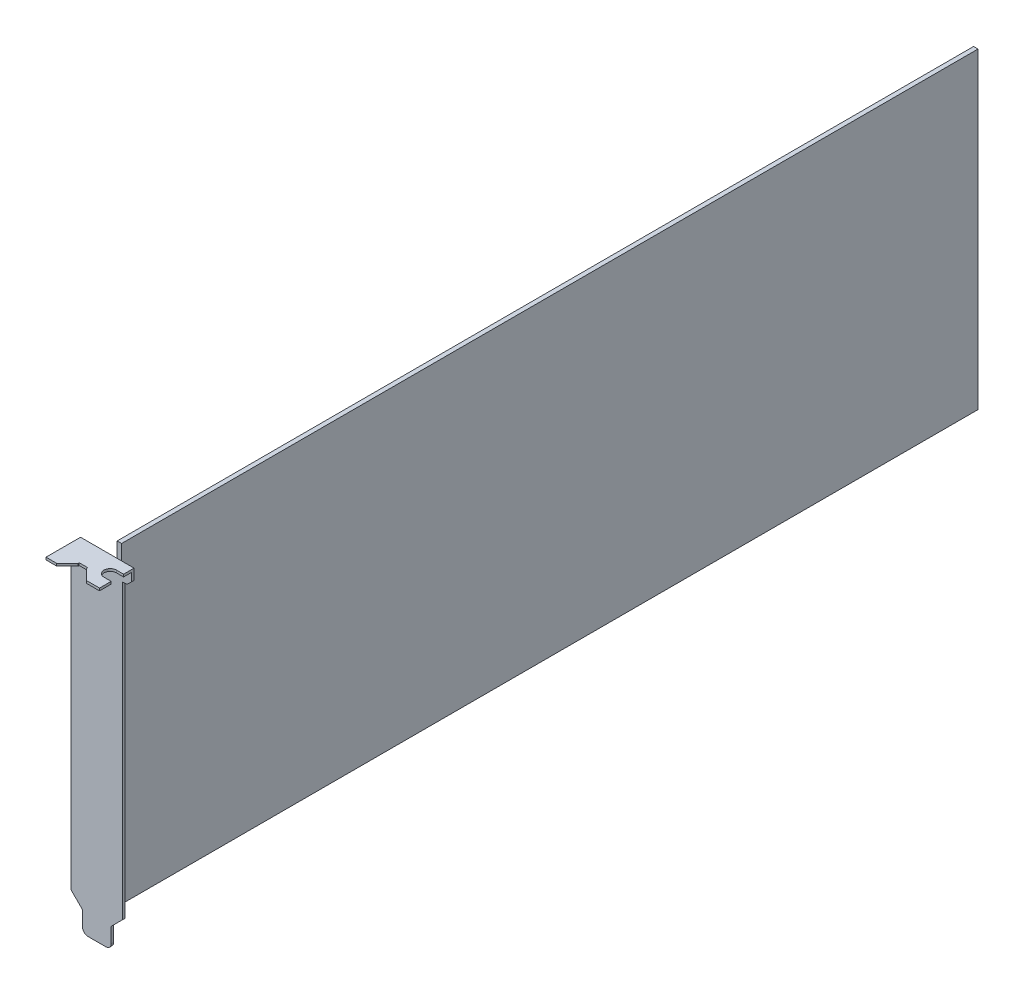
ISO-10303-21;
HEADER;
FILE_DESCRIPTION(('STEP AP214'),'2;1');
FILE_NAME('part.step','',(''),(''),'','','');
FILE_SCHEMA(('AUTOMOTIVE_DESIGN { 1 0 10303 214 1 1 1 1 }'));
ENDSEC;
DATA;
#1=APPLICATION_CONTEXT('core data for automotive mechanical design processes');
#2=APPLICATION_PROTOCOL_DEFINITION('international standard','automotive_design',2000,#1);
#3=PRODUCT_CONTEXT('',#1,'mechanical');
#4=PRODUCT('Part','Part','',(#3));
#5=PRODUCT_RELATED_PRODUCT_CATEGORY('part','',(#4));
#6=PRODUCT_DEFINITION_FORMATION('','',#4);
#7=PRODUCT_DEFINITION_CONTEXT('part definition',#1,'design');
#8=PRODUCT_DEFINITION('design','',#6,#7);
#9=PRODUCT_DEFINITION_SHAPE('','',#8);
#10=(LENGTH_UNIT() NAMED_UNIT(*) SI_UNIT(.MILLI.,.METRE.));
#11=(NAMED_UNIT(*) PLANE_ANGLE_UNIT() SI_UNIT($,.RADIAN.));
#12=(NAMED_UNIT(*) SI_UNIT($,.STERADIAN.) SOLID_ANGLE_UNIT());
#13=UNCERTAINTY_MEASURE_WITH_UNIT(LENGTH_MEASURE(1.E-05),#10,'distance_accuracy_value','');
#14=(GEOMETRIC_REPRESENTATION_CONTEXT(3) GLOBAL_UNCERTAINTY_ASSIGNED_CONTEXT((#13)) GLOBAL_UNIT_ASSIGNED_CONTEXT((#10,
#11,#12)) REPRESENTATION_CONTEXT('',''));
#15=CARTESIAN_POINT('',(0.,0.,0.));
#16=DIRECTION('',(0.,0.,1.));
#17=DIRECTION('',(1.,0.,0.));
#18=AXIS2_PLACEMENT_3D('',#15,#16,#17);
#19=CARTESIAN_POINT('',(6.01000000000003,100.35,305.66));
#20=DIRECTION('',(-1.,0.,0.));
#21=DIRECTION('',(0.,-1.,0.));
#22=AXIS2_PLACEMENT_3D('',#19,#20,#21);
#23=PLANE('',#22);
#24=DIRECTION('',(0.,0.,-1.));
#25=VECTOR('',#24,1.);
#26=CARTESIAN_POINT('',(6.01000000000003,104.91,317.09));
#27=LINE('',#26,#25);
#28=CARTESIAN_POINT('',(6.01000000000003,104.91,317.09));
#29=VERTEX_POINT('',#28);
#30=CARTESIAN_POINT('',(6.01000000000003,104.91,312.95));
#31=VERTEX_POINT('',#30);
#32=EDGE_CURVE('E269',#29,#31,#27,.T.);
#33=ORIENTED_EDGE('',*,*,#32,.T.);
#34=DIRECTION('',(0.,1.,0.));
#35=VECTOR('',#34,1.);
#36=CARTESIAN_POINT('',(6.01000000000003,-15.111,312.95));
#37=LINE('',#36,#35);
#38=CARTESIAN_POINT('',(6.01000000000003,105.77,312.95));
#39=VERTEX_POINT('',#38);
#40=EDGE_CURVE('E251',#31,#39,#37,.T.);
#41=ORIENTED_EDGE('',*,*,#40,.T.);
#42=DIRECTION('',(0.,0.,-1.));
#43=VECTOR('',#42,1.);
#44=CARTESIAN_POINT('',(6.01000000000003,105.77,317.09));
#45=LINE('',#44,#43);
#46=CARTESIAN_POINT('',(6.01000000000003,105.77,317.09));
#47=VERTEX_POINT('',#46);
#48=EDGE_CURVE('E284',#47,#39,#45,.T.);
#49=ORIENTED_EDGE('',*,*,#48,.F.);
#50=DIRECTION('',(0.,-1.,0.));
#51=VECTOR('',#50,1.);
#52=CARTESIAN_POINT('',(6.01000000000003,104.91,317.09));
#53=LINE('',#52,#51);
#54=EDGE_CURVE('E276',#47,#29,#53,.T.);
#55=ORIENTED_EDGE('',*,*,#54,.T.);
#56=EDGE_LOOP('',(#33,#41,#49,#55));
#57=FACE_BOUND('',#56,.T.);
#58=ADVANCED_FACE('F35',(#57),#23,.F.);
#59=CARTESIAN_POINT('',(0.,0.,317.09));
#60=DIRECTION('',(0.,0.,-1.));
#61=DIRECTION('',(-1.,0.,0.));
#62=AXIS2_PLACEMENT_3D('',#59,#60,#61);
#63=PLANE('',#62);
#64=DIRECTION('',(-1.,0.,0.));
#65=VECTOR('',#64,1.);
#66=CARTESIAN_POINT('',(-13.04,104.91,317.09));
#67=LINE('',#66,#65);
#68=CARTESIAN_POINT('',(-9.23000000000003,104.91,317.09));
#69=VERTEX_POINT('',#68);
#70=CARTESIAN_POINT('',(-13.04,104.91,317.09));
#71=VERTEX_POINT('',#70);
#72=EDGE_CURVE('E474',#69,#71,#67,.T.);
#73=ORIENTED_EDGE('',*,*,#72,.F.);
#74=DIRECTION('',(0.,1.,0.));
#75=VECTOR('',#74,1.);
#76=CARTESIAN_POINT('',(-9.23000000000003,-15.111,317.09));
#77=LINE('',#76,#75);
#78=CARTESIAN_POINT('',(-9.23000000000003,105.77,317.09));
#79=VERTEX_POINT('',#78);
#80=EDGE_CURVE('E496',#69,#79,#77,.T.);
#81=ORIENTED_EDGE('',*,*,#80,.T.);
#82=DIRECTION('',(1.,0.,0.));
#83=VECTOR('',#82,1.);
#84=CARTESIAN_POINT('',(-13.04,105.77,317.09));
#85=LINE('',#84,#83);
#86=CARTESIAN_POINT('',(-13.04,105.77,317.09));
#87=VERTEX_POINT('',#86);
#88=EDGE_CURVE('E480',#87,#79,#85,.T.);
#89=ORIENTED_EDGE('',*,*,#88,.F.);
#90=DIRECTION('',(0.,1.,0.));
#91=VECTOR('',#90,1.);
#92=CARTESIAN_POINT('',(-13.04,104.91,317.09));
#93=LINE('',#92,#91);
#94=EDGE_CURVE('E485',#71,#87,#93,.T.);
#95=ORIENTED_EDGE('',*,*,#94,.F.);
#96=EDGE_LOOP('',(#73,#81,#89,#95));
#97=FACE_BOUND('',#96,.T.);
#98=ADVANCED_FACE('F578',(#97),#63,.F.);
#99=CARTESIAN_POINT('',(0.,0.,304.8));
#100=DIRECTION('',(0.,0.,-1.));
#101=DIRECTION('',(-1.,0.,0.));
#102=AXIS2_PLACEMENT_3D('',#99,#100,#101);
#103=PLANE('',#102);
#104=DIRECTION('',(0.,-1.,0.));
#105=VECTOR('',#104,1.);
#106=CARTESIAN_POINT('',(0.,0.,304.8));
#107=LINE('',#106,#105);
#108=CARTESIAN_POINT('',(0.,111.15,304.8));
#109=VERTEX_POINT('',#108);
#110=CARTESIAN_POINT('',(0.,105.77,304.8));
#111=VERTEX_POINT('',#110);
#112=EDGE_CURVE('E377',#109,#111,#107,.T.);
#113=ORIENTED_EDGE('',*,*,#112,.T.);
#114=DIRECTION('',(1.,0.,0.));
#115=VECTOR('',#114,1.);
#116=CARTESIAN_POINT('',(-13.04,105.77,304.8));
#117=LINE('',#116,#115);
#118=CARTESIAN_POINT('',(1.56999999999998,105.77,304.8));
#119=VERTEX_POINT('',#118);
#120=EDGE_CURVE('E486',#111,#119,#117,.T.);
#121=ORIENTED_EDGE('',*,*,#120,.T.);
#122=DIRECTION('',(0.,1.,0.));
#123=VECTOR('',#122,1.);
#124=CARTESIAN_POINT('',(1.57,0.,304.8));
#125=LINE('',#124,#123);
#126=CARTESIAN_POINT('',(1.56999999999998,111.15,304.8));
#127=VERTEX_POINT('',#126);
#128=EDGE_CURVE('E384',#119,#127,#125,.T.);
#129=ORIENTED_EDGE('',*,*,#128,.T.);
#130=DIRECTION('',(-1.,0.,0.));
#131=VECTOR('',#130,1.);
#132=CARTESIAN_POINT('',(0.,111.15,304.8));
#133=LINE('',#132,#131);
#134=EDGE_CURVE('E387',#127,#109,#133,.T.);
#135=ORIENTED_EDGE('',*,*,#134,.T.);
#136=EDGE_LOOP('',(#113,#121,#129,#135));
#137=FACE_BOUND('',#136,.T.);
#138=ADVANCED_FACE('F584',(#137),#103,.F.);
#139=CARTESIAN_POINT('',(0.,0.,304.8));
#140=DIRECTION('',(1.,0.,0.));
#141=DIRECTION('',(0.,1.,0.));
#142=AXIS2_PLACEMENT_3D('',#139,#140,#141);
#143=PLANE('',#142);
#144=DIRECTION('',(0.,-1.,0.));
#145=VECTOR('',#144,1.);
#146=CARTESIAN_POINT('',(0.,0.,0.));
#147=LINE('',#146,#145);
#148=CARTESIAN_POINT('',(0.,111.15,0.));
#149=VERTEX_POINT('',#148);
#150=CARTESIAN_POINT('',(0.,0.,0.));
#151=VERTEX_POINT('',#150);
#152=EDGE_CURVE('E376',#149,#151,#147,.T.);
#153=ORIENTED_EDGE('',*,*,#152,.T.);
#154=DIRECTION('',(0.,0.,-1.));
#155=VECTOR('',#154,1.);
#156=CARTESIAN_POINT('',(0.,0.,304.8));
#157=LINE('',#156,#155);
#158=CARTESIAN_POINT('',(0.,0.,304.8));
#159=VERTEX_POINT('',#158);
#160=EDGE_CURVE('E406',#159,#151,#157,.T.);
#161=ORIENTED_EDGE('',*,*,#160,.F.);
#162=EDGE_CURVE('E381',#111,#159,#107,.T.);
#163=ORIENTED_EDGE('',*,*,#162,.F.);
#164=ORIENTED_EDGE('',*,*,#112,.F.);
#165=DIRECTION('',(0.,0.,-1.));
#166=VECTOR('',#165,1.);
#167=CARTESIAN_POINT('',(0.,111.15,304.8));
#168=LINE('',#167,#166);
#169=EDGE_CURVE('E389',#109,#149,#168,.T.);
#170=ORIENTED_EDGE('',*,*,#169,.T.);
#171=EDGE_LOOP('',(#153,#161,#163,#164,#170));
#172=FACE_BOUND('',#171,.T.);
#173=ADVANCED_FACE('F615',(#172),#143,.F.);
#174=CARTESIAN_POINT('',(0.,0.,304.8));
#175=DIRECTION('',(0.,1.,0.));
#176=DIRECTION('',(0.,0.,1.));
#177=AXIS2_PLACEMENT_3D('',#174,#175,#176);
#178=PLANE('',#177);
#179=DIRECTION('',(1.,0.,0.));
#180=VECTOR('',#179,1.);
#181=CARTESIAN_POINT('',(0.,0.,0.));
#182=LINE('',#181,#180);
#183=CARTESIAN_POINT('',(1.57,0.,0.));
#184=VERTEX_POINT('',#183);
#185=EDGE_CURVE('E392',#151,#184,#182,.T.);
#186=ORIENTED_EDGE('',*,*,#185,.T.);
#187=DIRECTION('',(0.,0.,-1.));
#188=VECTOR('',#187,1.);
#189=CARTESIAN_POINT('',(1.57,0.,304.8));
#190=LINE('',#189,#188);
#191=CARTESIAN_POINT('',(1.57,0.,304.8));
#192=VERTEX_POINT('',#191);
#193=EDGE_CURVE('E403',#192,#184,#190,.T.);
#194=ORIENTED_EDGE('',*,*,#193,.F.);
#195=DIRECTION('',(1.,0.,0.));
#196=VECTOR('',#195,1.);
#197=CARTESIAN_POINT('',(0.,0.,304.8));
#198=LINE('',#197,#196);
#199=EDGE_CURVE('E380',#159,#192,#198,.T.);
#200=ORIENTED_EDGE('',*,*,#199,.F.);
#201=ORIENTED_EDGE('',*,*,#160,.T.);
#202=EDGE_LOOP('',(#186,#194,#200,#201));
#203=FACE_BOUND('',#202,.T.);
#204=ADVANCED_FACE('F618',(#203),#178,.F.);
#205=CARTESIAN_POINT('',(1.57,0.,304.8));
#206=DIRECTION('',(-1.,0.,0.));
#207=DIRECTION('',(0.,-1.,0.));
#208=AXIS2_PLACEMENT_3D('',#205,#206,#207);
#209=PLANE('',#208);
#210=DIRECTION('',(0.,1.,0.));
#211=VECTOR('',#210,1.);
#212=CARTESIAN_POINT('',(1.57,0.,0.));
#213=LINE('',#212,#211);
#214=CARTESIAN_POINT('',(1.56999999999998,111.15,0.));
#215=VERTEX_POINT('',#214);
#216=EDGE_CURVE('E394',#184,#215,#213,.T.);
#217=ORIENTED_EDGE('',*,*,#216,.T.);
#218=DIRECTION('',(0.,0.,-1.));
#219=VECTOR('',#218,1.);
#220=CARTESIAN_POINT('',(1.56999999999998,111.15,304.8));
#221=LINE('',#220,#219);
#222=EDGE_CURVE('E400',#127,#215,#221,.T.);
#223=ORIENTED_EDGE('',*,*,#222,.F.);
#224=ORIENTED_EDGE('',*,*,#128,.F.);
#225=EDGE_CURVE('E385',#192,#119,#125,.T.);
#226=ORIENTED_EDGE('',*,*,#225,.F.);
#227=ORIENTED_EDGE('',*,*,#193,.T.);
#228=EDGE_LOOP('',(#217,#223,#224,#226,#227));
#229=FACE_BOUND('',#228,.T.);
#230=ADVANCED_FACE('F606',(#229),#209,.F.);
#231=CARTESIAN_POINT('',(0.,111.15,304.8));
#232=DIRECTION('',(0.,-1.,0.));
#233=DIRECTION('',(0.,0.,-1.));
#234=AXIS2_PLACEMENT_3D('',#231,#232,#233);
#235=PLANE('',#234);
#236=DIRECTION('',(-1.,0.,0.));
#237=VECTOR('',#236,1.);
#238=CARTESIAN_POINT('',(0.,111.15,0.));
#239=LINE('',#238,#237);
#240=EDGE_CURVE('E396',#215,#149,#239,.T.);
#241=ORIENTED_EDGE('',*,*,#240,.T.);
#242=ORIENTED_EDGE('',*,*,#169,.F.);
#243=ORIENTED_EDGE('',*,*,#134,.F.);
#244=ORIENTED_EDGE('',*,*,#222,.T.);
#245=EDGE_LOOP('',(#241,#242,#243,#244));
#246=FACE_BOUND('',#245,.T.);
#247=ADVANCED_FACE('F612',(#246),#235,.F.);
#248=CARTESIAN_POINT('',(0.,0.,0.));
#249=DIRECTION('',(0.,0.,-1.));
#250=DIRECTION('',(-1.,0.,0.));
#251=AXIS2_PLACEMENT_3D('',#248,#249,#250);
#252=PLANE('',#251);
#253=ORIENTED_EDGE('',*,*,#152,.F.);
#254=ORIENTED_EDGE('',*,*,#240,.F.);
#255=ORIENTED_EDGE('',*,*,#216,.F.);
#256=ORIENTED_EDGE('',*,*,#185,.F.);
#257=EDGE_LOOP('',(#253,#254,#255,#256));
#258=FACE_BOUND('',#257,.T.);
#259=ADVANCED_FACE('F620',(#258),#252,.T.);
#260=CARTESIAN_POINT('',(-15.58,-3.72000000000002,305.66));
#261=DIRECTION('',(1.,0.,0.));
#262=DIRECTION('',(0.,1.,0.));
#263=AXIS2_PLACEMENT_3D('',#260,#261,#262);
#264=PLANE('',#263);
#265=DIRECTION('',(0.,-1.,0.));
#266=VECTOR('',#265,1.);
#267=CARTESIAN_POINT('',(-15.58,-3.72000000000002,305.66));
#268=LINE('',#267,#266);
#269=CARTESIAN_POINT('',(-15.58,99.29,305.66));
#270=VERTEX_POINT('',#269);
#271=CARTESIAN_POINT('',(-15.58,-3.72000000000002,305.66));
#272=VERTEX_POINT('',#271);
#273=EDGE_CURVE('E316',#270,#272,#268,.T.);
#274=ORIENTED_EDGE('',*,*,#273,.F.);
#275=DIRECTION('',(0.,0.,1.));
#276=VECTOR('',#275,1.);
#277=CARTESIAN_POINT('',(-15.58,99.29,-0.000999999999973245));
#278=LINE('',#277,#276);
#279=CARTESIAN_POINT('',(-15.58,99.29,304.8));
#280=VERTEX_POINT('',#279);
#281=EDGE_CURVE('E308',#280,#270,#278,.T.);
#282=ORIENTED_EDGE('',*,*,#281,.F.);
#283=DIRECTION('',(0.,-1.,0.));
#284=VECTOR('',#283,1.);
#285=CARTESIAN_POINT('',(-15.58,-3.72000000000002,304.8));
#286=LINE('',#285,#284);
#287=CARTESIAN_POINT('',(-15.58,-3.72000000000002,304.8));
#288=VERTEX_POINT('',#287);
#289=EDGE_CURVE('E315',#280,#288,#286,.T.);
#290=ORIENTED_EDGE('',*,*,#289,.T.);
#291=DIRECTION('',(0.,0.,-1.));
#292=VECTOR('',#291,1.);
#293=CARTESIAN_POINT('',(-15.58,-3.72000000000002,305.66));
#294=LINE('',#293,#292);
#295=EDGE_CURVE('E373',#272,#288,#294,.T.);
#296=ORIENTED_EDGE('',*,*,#295,.F.);
#297=EDGE_LOOP('',(#274,#282,#290,#296));
#298=FACE_BOUND('',#297,.T.);
#299=ADVANCED_FACE('F459',(#298),#264,.F.);
#300=CARTESIAN_POINT('',(-15.58,-3.72000000000002,305.66));
#301=DIRECTION('',(0.707106781186546,0.707106781186549,0.));
#302=DIRECTION('',(-0.707106781186549,0.707106781186546,0.));
#303=AXIS2_PLACEMENT_3D('',#300,#301,#302);
#304=PLANE('',#303);
#305=DIRECTION('',(0.707106781186549,-0.707106781186546,0.));
#306=VECTOR('',#305,1.);
#307=CARTESIAN_POINT('',(-15.58,-3.72000000000002,304.8));
#308=LINE('',#307,#306);
#309=CARTESIAN_POINT('',(-11.46,-7.84,304.8));
#310=VERTEX_POINT('',#309);
#311=EDGE_CURVE('E343',#288,#310,#308,.T.);
#312=ORIENTED_EDGE('',*,*,#311,.T.);
#313=DIRECTION('',(0.,0.,-1.));
#314=VECTOR('',#313,1.);
#315=CARTESIAN_POINT('',(-11.46,-7.84,305.66));
#316=LINE('',#315,#314);
#317=CARTESIAN_POINT('',(-11.46,-7.84,305.66));
#318=VERTEX_POINT('',#317);
#319=EDGE_CURVE('E370',#318,#310,#316,.T.);
#320=ORIENTED_EDGE('',*,*,#319,.F.);
#321=DIRECTION('',(0.707106781186549,-0.707106781186546,0.));
#322=VECTOR('',#321,1.);
#323=CARTESIAN_POINT('',(-15.58,-3.72000000000002,305.66));
#324=LINE('',#323,#322);
#325=EDGE_CURVE('E318',#272,#318,#324,.T.);
#326=ORIENTED_EDGE('',*,*,#325,.F.);
#327=ORIENTED_EDGE('',*,*,#295,.T.);
#328=EDGE_LOOP('',(#312,#320,#326,#327));
#329=FACE_BOUND('',#328,.T.);
#330=ADVANCED_FACE('F453',(#329),#304,.F.);
#331=CARTESIAN_POINT('',(-11.46,-7.84,305.66));
#332=DIRECTION('',(1.,0.,0.));
#333=DIRECTION('',(0.,1.,0.));
#334=AXIS2_PLACEMENT_3D('',#331,#332,#333);
#335=PLANE('',#334);
#336=DIRECTION('',(0.,-1.,0.));
#337=VECTOR('',#336,1.);
#338=CARTESIAN_POINT('',(-11.46,-7.84,304.8));
#339=LINE('',#338,#337);
#340=CARTESIAN_POINT('',(-11.46,-13.2,304.8));
#341=VERTEX_POINT('',#340);
#342=EDGE_CURVE('E345',#310,#341,#339,.T.);
#343=ORIENTED_EDGE('',*,*,#342,.T.);
#344=DIRECTION('',(0.,0.,-1.));
#345=VECTOR('',#344,1.);
#346=CARTESIAN_POINT('',(-11.46,-13.2,305.66));
#347=LINE('',#346,#345);
#348=CARTESIAN_POINT('',(-11.46,-13.2,305.66));
#349=VERTEX_POINT('',#348);
#350=EDGE_CURVE('E427',#341,#349,#347,.F.);
#351=ORIENTED_EDGE('',*,*,#350,.T.);
#352=DIRECTION('',(0.,-1.,0.));
#353=VECTOR('',#352,1.);
#354=CARTESIAN_POINT('',(-11.46,-7.84,305.66));
#355=LINE('',#354,#353);
#356=EDGE_CURVE('E321',#318,#349,#355,.T.);
#357=ORIENTED_EDGE('',*,*,#356,.F.);
#358=ORIENTED_EDGE('',*,*,#319,.T.);
#359=EDGE_LOOP('',(#343,#351,#357,#358));
#360=FACE_BOUND('',#359,.T.);
#361=ADVANCED_FACE('F449',(#360),#335,.F.);
#362=CARTESIAN_POINT('',(-11.46,-15.11,305.66));
#363=DIRECTION('',(0.,1.,0.));
#364=DIRECTION('',(0.,0.,1.));
#365=AXIS2_PLACEMENT_3D('',#362,#363,#364);
#366=PLANE('',#365);
#367=DIRECTION('',(1.,0.,0.));
#368=VECTOR('',#367,1.);
#369=CARTESIAN_POINT('',(-11.46,-15.11,305.66));
#370=LINE('',#369,#368);
#371=CARTESIAN_POINT('',(-9.54999999999998,-15.11,305.66));
#372=VERTEX_POINT('',#371);
#373=CARTESIAN_POINT('',(-3.17999999999998,-15.11,305.66));
#374=VERTEX_POINT('',#373);
#375=EDGE_CURVE('E324',#372,#374,#370,.T.);
#376=ORIENTED_EDGE('',*,*,#375,.F.);
#377=DIRECTION('',(0.,0.,-1.));
#378=VECTOR('',#377,1.);
#379=CARTESIAN_POINT('',(-9.54999999999998,-15.11,305.66));
#380=LINE('',#379,#378);
#381=CARTESIAN_POINT('',(-9.54999999999998,-15.11,304.8));
#382=VERTEX_POINT('',#381);
#383=EDGE_CURVE('E420',#372,#382,#380,.T.);
#384=ORIENTED_EDGE('',*,*,#383,.T.);
#385=DIRECTION('',(1.,0.,0.));
#386=VECTOR('',#385,1.);
#387=CARTESIAN_POINT('',(-11.46,-15.11,304.8));
#388=LINE('',#387,#386);
#389=CARTESIAN_POINT('',(-3.17999999999998,-15.11,304.8));
#390=VERTEX_POINT('',#389);
#391=EDGE_CURVE('E348',#382,#390,#388,.T.);
#392=ORIENTED_EDGE('',*,*,#391,.T.);
#393=DIRECTION('',(0.,0.,-1.));
#394=VECTOR('',#393,1.);
#395=CARTESIAN_POINT('',(-3.17999999999998,-15.11,305.66));
#396=LINE('',#395,#394);
#397=EDGE_CURVE('E418',#390,#374,#396,.F.);
#398=ORIENTED_EDGE('',*,*,#397,.T.);
#399=EDGE_LOOP('',(#376,#384,#392,#398));
#400=FACE_BOUND('',#399,.T.);
#401=ADVANCED_FACE('F440',(#400),#366,.F.);
#402=CARTESIAN_POINT('',(-1.26999999999998,-15.11,305.66));
#403=DIRECTION('',(-1.,0.,0.));
#404=DIRECTION('',(0.,-1.,0.));
#405=AXIS2_PLACEMENT_3D('',#402,#403,#404);
#406=PLANE('',#405);
#407=DIRECTION('',(0.,1.,0.));
#408=VECTOR('',#407,1.);
#409=CARTESIAN_POINT('',(-1.26999999999998,-15.11,305.66));
#410=LINE('',#409,#408);
#411=CARTESIAN_POINT('',(-1.26999999999998,-13.2,305.66));
#412=VERTEX_POINT('',#411);
#413=CARTESIAN_POINT('',(-1.26999999999998,-7.84,305.66));
#414=VERTEX_POINT('',#413);
#415=EDGE_CURVE('E327',#412,#414,#410,.T.);
#416=ORIENTED_EDGE('',*,*,#415,.F.);
#417=DIRECTION('',(0.,0.,-1.));
#418=VECTOR('',#417,1.);
#419=CARTESIAN_POINT('',(-1.26999999999998,-13.2,305.66));
#420=LINE('',#419,#418);
#421=CARTESIAN_POINT('',(-1.26999999999998,-13.2,304.8));
#422=VERTEX_POINT('',#421);
#423=EDGE_CURVE('E11',#412,#422,#420,.T.);
#424=ORIENTED_EDGE('',*,*,#423,.T.);
#425=DIRECTION('',(0.,1.,0.));
#426=VECTOR('',#425,1.);
#427=CARTESIAN_POINT('',(-1.26999999999998,-15.11,304.8));
#428=LINE('',#427,#426);
#429=CARTESIAN_POINT('',(-1.26999999999998,-7.84,304.8));
#430=VERTEX_POINT('',#429);
#431=EDGE_CURVE('E351',#422,#430,#428,.T.);
#432=ORIENTED_EDGE('',*,*,#431,.T.);
#433=DIRECTION('',(0.,0.,-1.));
#434=VECTOR('',#433,1.);
#435=CARTESIAN_POINT('',(-1.26999999999998,-7.84,305.66));
#436=LINE('',#435,#434);
#437=EDGE_CURVE('E367',#414,#430,#436,.T.);
#438=ORIENTED_EDGE('',*,*,#437,.F.);
#439=EDGE_LOOP('',(#416,#424,#432,#438));
#440=FACE_BOUND('',#439,.T.);
#441=ADVANCED_FACE('F654',(#440),#406,.F.);
#442=CARTESIAN_POINT('',(-1.26999999999998,-7.84,305.66));
#443=DIRECTION('',(-0.707106781186549,0.707106781186546,0.));
#444=DIRECTION('',(-0.707106781186546,-0.707106781186549,0.));
#445=AXIS2_PLACEMENT_3D('',#442,#443,#444);
#446=PLANE('',#445);
#447=DIRECTION('',(0.707106781186546,0.707106781186549,0.));
#448=VECTOR('',#447,1.);
#449=CARTESIAN_POINT('',(-1.26999999999998,-7.84,304.8));
#450=LINE('',#449,#448);
#451=CARTESIAN_POINT('',(2.84000000000003,-3.72999999999997,304.8));
#452=VERTEX_POINT('',#451);
#453=EDGE_CURVE('E353',#430,#452,#450,.T.);
#454=ORIENTED_EDGE('',*,*,#453,.T.);
#455=DIRECTION('',(0.,0.,-1.));
#456=VECTOR('',#455,1.);
#457=CARTESIAN_POINT('',(2.84000000000003,-3.72999999999997,305.66));
#458=LINE('',#457,#456);
#459=CARTESIAN_POINT('',(2.84000000000003,-3.72999999999997,305.66));
#460=VERTEX_POINT('',#459);
#461=EDGE_CURVE('E364',#460,#452,#458,.T.);
#462=ORIENTED_EDGE('',*,*,#461,.F.);
#463=DIRECTION('',(0.707106781186546,0.707106781186549,0.));
#464=VECTOR('',#463,1.);
#465=CARTESIAN_POINT('',(-1.26999999999998,-7.84,305.66));
#466=LINE('',#465,#464);
#467=EDGE_CURVE('E329',#414,#460,#466,.T.);
#468=ORIENTED_EDGE('',*,*,#467,.F.);
#469=ORIENTED_EDGE('',*,*,#437,.T.);
#470=EDGE_LOOP('',(#454,#462,#468,#469));
#471=FACE_BOUND('',#470,.T.);
#472=ADVANCED_FACE('F660',(#471),#446,.F.);
#473=CARTESIAN_POINT('',(2.84000000000002,100.35,305.66));
#474=DIRECTION('',(-1.,0.,0.));
#475=DIRECTION('',(0.,-1.,0.));
#476=AXIS2_PLACEMENT_3D('',#473,#474,#475);
#477=PLANE('',#476);
#478=DIRECTION('',(0.,1.,0.));
#479=VECTOR('',#478,1.);
#480=CARTESIAN_POINT('',(2.84000000000002,100.35,304.8));
#481=LINE('',#480,#479);
#482=CARTESIAN_POINT('',(2.84000000000002,100.35,304.8));
#483=VERTEX_POINT('',#482);
#484=EDGE_CURVE('E355',#452,#483,#481,.T.);
#485=ORIENTED_EDGE('',*,*,#484,.T.);
#486=DIRECTION('',(0.,0.,-1.));
#487=VECTOR('',#486,1.);
#488=CARTESIAN_POINT('',(2.84000000000002,100.35,305.66));
#489=LINE('',#488,#487);
#490=CARTESIAN_POINT('',(2.84000000000002,100.35,305.66));
#491=VERTEX_POINT('',#490);
#492=EDGE_CURVE('E341',#491,#483,#489,.T.);
#493=ORIENTED_EDGE('',*,*,#492,.F.);
#494=DIRECTION('',(0.,1.,0.));
#495=VECTOR('',#494,1.);
#496=CARTESIAN_POINT('',(2.84000000000002,100.35,305.66));
#497=LINE('',#496,#495);
#498=EDGE_CURVE('E331',#460,#491,#497,.T.);
#499=ORIENTED_EDGE('',*,*,#498,.F.);
#500=ORIENTED_EDGE('',*,*,#461,.T.);
#501=EDGE_LOOP('',(#485,#493,#499,#500));
#502=FACE_BOUND('',#501,.T.);
#503=ADVANCED_FACE('F596',(#502),#477,.F.);
#504=CARTESIAN_POINT('',(2.84000000000002,100.35,305.66));
#505=DIRECTION('',(0.,1.,0.));
#506=DIRECTION('',(0.,0.,1.));
#507=AXIS2_PLACEMENT_3D('',#504,#505,#506);
#508=PLANE('',#507);
#509=DIRECTION('',(1.,0.,0.));
#510=VECTOR('',#509,1.);
#511=CARTESIAN_POINT('',(2.84000000000002,100.35,304.8));
#512=LINE('',#511,#510);
#513=CARTESIAN_POINT('',(3.84394877578623,100.35,304.8));
#514=VERTEX_POINT('',#513);
#515=EDGE_CURVE('E357',#483,#514,#512,.T.);
#516=ORIENTED_EDGE('',*,*,#515,.T.);
#517=DIRECTION('',(0.,0.,1.));
#518=VECTOR('',#517,1.);
#519=CARTESIAN_POINT('',(3.84394877578623,100.35,305.66));
#520=LINE('',#519,#518);
#521=CARTESIAN_POINT('',(3.84394877578623,100.35,305.66));
#522=VERTEX_POINT('',#521);
#523=EDGE_CURVE('E409',#514,#522,#520,.T.);
#524=ORIENTED_EDGE('',*,*,#523,.T.);
#525=DIRECTION('',(1.,0.,0.));
#526=VECTOR('',#525,1.);
#527=CARTESIAN_POINT('',(2.84000000000002,100.35,305.66));
#528=LINE('',#527,#526);
#529=EDGE_CURVE('E333',#491,#522,#528,.T.);
#530=ORIENTED_EDGE('',*,*,#529,.F.);
#531=ORIENTED_EDGE('',*,*,#492,.T.);
#532=EDGE_LOOP('',(#516,#524,#530,#531));
#533=FACE_BOUND('',#532,.T.);
#534=ADVANCED_FACE('F589',(#533),#508,.F.);
#535=CARTESIAN_POINT('',(6.01000000000003,105.77,308.53));
#536=VERTEX_POINT('',#535);
#537=CARTESIAN_POINT('',(6.01000000000003,105.77,304.8));
#538=VERTEX_POINT('',#537);
#539=EDGE_CURVE('E288',#536,#538,#45,.T.);
#540=ORIENTED_EDGE('',*,*,#539,.F.);
#541=DIRECTION('',(0.,1.,0.));
#542=VECTOR('',#541,1.);
#543=CARTESIAN_POINT('',(6.01000000000003,-15.111,308.53));
#544=LINE('',#543,#542);
#545=CARTESIAN_POINT('',(6.01000000000003,104.91,308.53));
#546=VERTEX_POINT('',#545);
#547=EDGE_CURVE('E50',#546,#536,#544,.T.);
#548=ORIENTED_EDGE('',*,*,#547,.F.);
#549=CARTESIAN_POINT('',(6.01000000000003,104.91,305.66));
#550=VERTEX_POINT('',#549);
#551=EDGE_CURVE('E279',#546,#550,#27,.T.);
#552=ORIENTED_EDGE('',*,*,#551,.T.);
#553=DIRECTION('',(0.,1.,0.));
#554=VECTOR('',#553,1.);
#555=CARTESIAN_POINT('',(6.01000000000003,100.35,305.66));
#556=LINE('',#555,#554);
#557=CARTESIAN_POINT('',(6.01000000000003,101.99,305.66));
#558=VERTEX_POINT('',#557);
#559=EDGE_CURVE('E336',#558,#550,#556,.T.);
#560=ORIENTED_EDGE('',*,*,#559,.F.);
#561=DIRECTION('',(0.,0.,1.));
#562=VECTOR('',#561,1.);
#563=CARTESIAN_POINT('',(6.01000000000003,101.99,-0.000999999999973245));
#564=LINE('',#563,#562);
#565=CARTESIAN_POINT('',(6.01000000000003,101.99,304.8));
#566=VERTEX_POINT('',#565);
#567=EDGE_CURVE('E295',#566,#558,#564,.T.);
#568=ORIENTED_EDGE('',*,*,#567,.F.);
#569=DIRECTION('',(0.,1.,0.));
#570=VECTOR('',#569,1.);
#571=CARTESIAN_POINT('',(6.01000000000003,100.35,304.8));
#572=LINE('',#571,#570);
#573=EDGE_CURVE('E319',#566,#538,#572,.T.);
#574=ORIENTED_EDGE('',*,*,#573,.T.);
#575=EDGE_LOOP('',(#540,#548,#552,#560,#568,#574));
#576=FACE_BOUND('',#575,.T.);
#577=ADVANCED_FACE('F580',(#576),#23,.F.);
#578=CARTESIAN_POINT('',(0.,0.,305.66));
#579=DIRECTION('',(0.,0.,-1.));
#580=DIRECTION('',(-1.,0.,0.));
#581=AXIS2_PLACEMENT_3D('',#578,#579,#580);
#582=PLANE('',#581);
#583=ORIENTED_EDGE('',*,*,#356,.T.);
#584=CARTESIAN_POINT('',(-9.54999999999998,-13.2,305.66));
#585=DIRECTION('',(0.,0.,-1.));
#586=DIRECTION('',(-1.,0.,0.));
#587=AXIS2_PLACEMENT_3D('',#584,#585,#586);
#588=CIRCLE('',#587,1.91);
#589=EDGE_CURVE('E43',#349,#372,#588,.F.);
#590=ORIENTED_EDGE('',*,*,#589,.T.);
#591=ORIENTED_EDGE('',*,*,#375,.T.);
#592=CARTESIAN_POINT('',(-3.17999999999998,-13.2,305.66));
#593=DIRECTION('',(0.,0.,-1.));
#594=DIRECTION('',(-1.,0.,0.));
#595=AXIS2_PLACEMENT_3D('',#592,#593,#594);
#596=CIRCLE('',#595,1.91);
#597=EDGE_CURVE('E429',#374,#412,#596,.F.);
#598=ORIENTED_EDGE('',*,*,#597,.T.);
#599=ORIENTED_EDGE('',*,*,#415,.T.);
#600=ORIENTED_EDGE('',*,*,#467,.T.);
#601=ORIENTED_EDGE('',*,*,#498,.T.);
#602=ORIENTED_EDGE('',*,*,#529,.T.);
#603=CARTESIAN_POINT('',(3.84394877578623,101.62,305.66));
#604=DIRECTION('',(0.,0.,-1.));
#605=DIRECTION('',(-1.,0.,0.));
#606=AXIS2_PLACEMENT_3D('',#603,#604,#605);
#607=CIRCLE('',#606,1.27);
#608=CARTESIAN_POINT('',(4.74197438789315,100.721974387893,305.66));
#609=VERTEX_POINT('',#608);
#610=EDGE_CURVE('E412',#522,#609,#607,.F.);
#611=ORIENTED_EDGE('',*,*,#610,.T.);
#612=DIRECTION('',(-0.707106781186542,-0.707106781186553,0.));
#613=VECTOR('',#612,1.);
#614=CARTESIAN_POINT('',(6.01000000000003,101.99,305.66));
#615=LINE('',#614,#613);
#616=EDGE_CURVE('E282',#558,#609,#615,.T.);
#617=ORIENTED_EDGE('',*,*,#616,.F.);
#618=ORIENTED_EDGE('',*,*,#559,.T.);
#619=DIRECTION('',(-1.,0.,0.));
#620=VECTOR('',#619,1.);
#621=CARTESIAN_POINT('',(6.01000000000003,104.91,305.66));
#622=LINE('',#621,#620);
#623=CARTESIAN_POINT('',(-13.04,104.91,305.66));
#624=VERTEX_POINT('',#623);
#625=EDGE_CURVE('E339',#550,#624,#622,.T.);
#626=ORIENTED_EDGE('',*,*,#625,.T.);
#627=DIRECTION('',(0.,1.,0.));
#628=VECTOR('',#627,1.);
#629=CARTESIAN_POINT('',(-13.04,101.83,305.66));
#630=LINE('',#629,#628);
#631=CARTESIAN_POINT('',(-13.04,101.83,305.66));
#632=VERTEX_POINT('',#631);
#633=EDGE_CURVE('E305',#632,#624,#630,.T.);
#634=ORIENTED_EDGE('',*,*,#633,.F.);
#635=DIRECTION('',(0.707106781186544,0.707106781186551,0.));
#636=VECTOR('',#635,1.);
#637=CARTESIAN_POINT('',(-15.58,99.29,305.66));
#638=LINE('',#637,#636);
#639=EDGE_CURVE('E302',#270,#632,#638,.T.);
#640=ORIENTED_EDGE('',*,*,#639,.F.);
#641=ORIENTED_EDGE('',*,*,#273,.T.);
#642=ORIENTED_EDGE('',*,*,#325,.T.);
#643=EDGE_LOOP('',(#583,#590,#591,#598,#599,#600,#601,#602,#611,#617,#618,#626,#634,#640,#641,#642));
#644=FACE_BOUND('',#643,.T.);
#645=ADVANCED_FACE('F433',(#644),#582,.F.);
#646=CARTESIAN_POINT('',(0.,0.,304.8));
#647=DIRECTION('',(0.,0.,-1.));
#648=DIRECTION('',(-1.,0.,0.));
#649=AXIS2_PLACEMENT_3D('',#646,#647,#648);
#650=PLANE('',#649);
#651=ORIENTED_EDGE('',*,*,#391,.F.);
#652=CARTESIAN_POINT('',(-9.54999999999998,-13.2,304.8));
#653=DIRECTION('',(0.,0.,-1.));
#654=DIRECTION('',(-1.,0.,0.));
#655=AXIS2_PLACEMENT_3D('',#652,#653,#654);
#656=CIRCLE('',#655,1.91);
#657=EDGE_CURVE('E425',#382,#341,#656,.T.);
#658=ORIENTED_EDGE('',*,*,#657,.T.);
#659=ORIENTED_EDGE('',*,*,#342,.F.);
#660=ORIENTED_EDGE('',*,*,#311,.F.);
#661=ORIENTED_EDGE('',*,*,#289,.F.);
#662=DIRECTION('',(0.707106781186544,0.707106781186551,0.));
#663=VECTOR('',#662,1.);
#664=CARTESIAN_POINT('',(-15.58,99.29,304.8));
#665=LINE('',#664,#663);
#666=CARTESIAN_POINT('',(-13.04,101.83,304.8));
#667=VERTEX_POINT('',#666);
#668=EDGE_CURVE('E311',#280,#667,#665,.T.);
#669=ORIENTED_EDGE('',*,*,#668,.T.);
#670=DIRECTION('',(0.,1.,0.));
#671=VECTOR('',#670,1.);
#672=CARTESIAN_POINT('',(-13.04,101.83,304.8));
#673=LINE('',#672,#671);
#674=CARTESIAN_POINT('',(-13.04,105.77,304.8));
#675=VERTEX_POINT('',#674);
#676=EDGE_CURVE('E300',#667,#675,#673,.T.);
#677=ORIENTED_EDGE('',*,*,#676,.T.);
#678=EDGE_CURVE('E483',#675,#111,#117,.T.);
#679=ORIENTED_EDGE('',*,*,#678,.T.);
#680=ORIENTED_EDGE('',*,*,#162,.T.);
#681=ORIENTED_EDGE('',*,*,#199,.T.);
#682=ORIENTED_EDGE('',*,*,#225,.T.);
#683=EDGE_CURVE('E487',#119,#538,#117,.T.);
#684=ORIENTED_EDGE('',*,*,#683,.T.);
#685=ORIENTED_EDGE('',*,*,#573,.F.);
#686=DIRECTION('',(-0.707106781186542,-0.707106781186553,0.));
#687=VECTOR('',#686,1.);
#688=CARTESIAN_POINT('',(6.01000000000003,101.99,304.8));
#689=LINE('',#688,#687);
#690=CARTESIAN_POINT('',(4.74197438789315,100.721974387893,304.8));
#691=VERTEX_POINT('',#690);
#692=EDGE_CURVE('E297',#566,#691,#689,.T.);
#693=ORIENTED_EDGE('',*,*,#692,.T.);
#694=CARTESIAN_POINT('',(3.84394877578623,101.62,304.8));
#695=DIRECTION('',(0.,0.,-1.));
#696=DIRECTION('',(-1.,0.,0.));
#697=AXIS2_PLACEMENT_3D('',#694,#695,#696);
#698=CIRCLE('',#697,1.27);
#699=EDGE_CURVE('E416',#691,#514,#698,.T.);
#700=ORIENTED_EDGE('',*,*,#699,.T.);
#701=ORIENTED_EDGE('',*,*,#515,.F.);
#702=ORIENTED_EDGE('',*,*,#484,.F.);
#703=ORIENTED_EDGE('',*,*,#453,.F.);
#704=ORIENTED_EDGE('',*,*,#431,.F.);
#705=CARTESIAN_POINT('',(-3.17999999999998,-13.2,304.8));
#706=DIRECTION('',(0.,0.,-1.));
#707=DIRECTION('',(-1.,0.,0.));
#708=AXIS2_PLACEMENT_3D('',#705,#706,#707);
#709=CIRCLE('',#708,1.91);
#710=EDGE_CURVE('E423',#422,#390,#709,.T.);
#711=ORIENTED_EDGE('',*,*,#710,.T.);
#712=EDGE_LOOP('',(#651,#658,#659,#660,#661,#669,#677,#679,#680,#681,#682,#684,#685,#693,#700,
#701,#702,#703,#704,#711));
#713=FACE_BOUND('',#712,.T.);
#714=ADVANCED_FACE('F446',(#713),#650,.T.);
#715=CARTESIAN_POINT('',(-13.04,101.83,-0.000999999999973245));
#716=DIRECTION('',(1.,0.,0.));
#717=DIRECTION('',(0.,0.,-1.));
#718=AXIS2_PLACEMENT_3D('',#715,#716,#717);
#719=PLANE('',#718);
#720=DIRECTION('',(0.,0.,1.));
#721=VECTOR('',#720,1.);
#722=CARTESIAN_POINT('',(-13.04,101.83,-0.000999999999973245));
#723=LINE('',#722,#721);
#724=EDGE_CURVE('E309',#667,#632,#723,.T.);
#725=ORIENTED_EDGE('',*,*,#724,.T.);
#726=ORIENTED_EDGE('',*,*,#633,.T.);
#727=DIRECTION('',(0.,0.,-1.));
#728=VECTOR('',#727,1.);
#729=CARTESIAN_POINT('',(-13.04,104.91,317.09));
#730=LINE('',#729,#728);
#731=EDGE_CURVE('E278',#71,#624,#730,.T.);
#732=ORIENTED_EDGE('',*,*,#731,.F.);
#733=ORIENTED_EDGE('',*,*,#94,.T.);
#734=DIRECTION('',(0.,0.,-1.));
#735=VECTOR('',#734,1.);
#736=CARTESIAN_POINT('',(-13.04,105.77,317.09));
#737=LINE('',#736,#735);
#738=EDGE_CURVE('E289',#87,#675,#737,.T.);
#739=ORIENTED_EDGE('',*,*,#738,.T.);
#740=ORIENTED_EDGE('',*,*,#676,.F.);
#741=EDGE_LOOP('',(#725,#726,#732,#733,#739,#740));
#742=FACE_BOUND('',#741,.T.);
#743=ADVANCED_FACE('F467',(#742),#719,.F.);
#744=CARTESIAN_POINT('',(-15.58,99.29,-0.000999999999973245));
#745=DIRECTION('',(0.707106781186551,-0.707106781186544,0.));
#746=DIRECTION('',(0.707106781186544,0.707106781186551,0.));
#747=AXIS2_PLACEMENT_3D('',#744,#745,#746);
#748=PLANE('',#747);
#749=ORIENTED_EDGE('',*,*,#281,.T.);
#750=ORIENTED_EDGE('',*,*,#639,.T.);
#751=ORIENTED_EDGE('',*,*,#724,.F.);
#752=ORIENTED_EDGE('',*,*,#668,.F.);
#753=EDGE_LOOP('',(#749,#750,#751,#752));
#754=FACE_BOUND('',#753,.T.);
#755=ADVANCED_FACE('F462',(#754),#748,.F.);
#756=CARTESIAN_POINT('',(6.01000000000003,101.99,-0.000999999999973245));
#757=DIRECTION('',(-0.707106781186553,0.707106781186542,0.));
#758=DIRECTION('',(-0.707106781186542,-0.707106781186553,0.));
#759=AXIS2_PLACEMENT_3D('',#756,#757,#758);
#760=PLANE('',#759);
#761=ORIENTED_EDGE('',*,*,#616,.T.);
#762=DIRECTION('',(0.,0.,1.));
#763=VECTOR('',#762,1.);
#764=CARTESIAN_POINT('',(4.74197438789315,100.721974387893,-0.000999999999973245));
#765=LINE('',#764,#763);
#766=EDGE_CURVE('E414',#609,#691,#765,.F.);
#767=ORIENTED_EDGE('',*,*,#766,.T.);
#768=ORIENTED_EDGE('',*,*,#692,.F.);
#769=ORIENTED_EDGE('',*,*,#567,.T.);
#770=EDGE_LOOP('',(#761,#767,#768,#769));
#771=FACE_BOUND('',#770,.T.);
#772=ADVANCED_FACE('F639',(#771),#760,.F.);
#773=CARTESIAN_POINT('',(3.84394877578623,101.62,305.66));
#774=DIRECTION('',(0.,0.,1.));
#775=DIRECTION('',(1.,0.,0.));
#776=AXIS2_PLACEMENT_3D('',#773,#774,#775);
#777=CYLINDRICAL_SURFACE('',#776,1.27);
#778=ORIENTED_EDGE('',*,*,#699,.F.);
#779=ORIENTED_EDGE('',*,*,#766,.F.);
#780=ORIENTED_EDGE('',*,*,#610,.F.);
#781=ORIENTED_EDGE('',*,*,#523,.F.);
#782=EDGE_LOOP('',(#778,#779,#780,#781));
#783=FACE_BOUND('',#782,.T.);
#784=ADVANCED_FACE('F637',(#783),#777,.T.);
#785=CARTESIAN_POINT('',(-9.54999999999998,-13.2,305.66));
#786=DIRECTION('',(0.,0.,-1.));
#787=DIRECTION('',(-1.,0.,0.));
#788=AXIS2_PLACEMENT_3D('',#785,#786,#787);
#789=CYLINDRICAL_SURFACE('',#788,1.91);
#790=ORIENTED_EDGE('',*,*,#589,.F.);
#791=ORIENTED_EDGE('',*,*,#350,.F.);
#792=ORIENTED_EDGE('',*,*,#657,.F.);
#793=ORIENTED_EDGE('',*,*,#383,.F.);
#794=EDGE_LOOP('',(#790,#791,#792,#793));
#795=FACE_BOUND('',#794,.T.);
#796=ADVANCED_FACE('F443',(#795),#789,.T.);
#797=CARTESIAN_POINT('',(-3.17999999999998,-13.2,305.66));
#798=DIRECTION('',(0.,0.,-1.));
#799=DIRECTION('',(-1.,0.,0.));
#800=AXIS2_PLACEMENT_3D('',#797,#798,#799);
#801=CYLINDRICAL_SURFACE('',#800,1.91);
#802=ORIENTED_EDGE('',*,*,#597,.F.);
#803=ORIENTED_EDGE('',*,*,#397,.F.);
#804=ORIENTED_EDGE('',*,*,#710,.F.);
#805=ORIENTED_EDGE('',*,*,#423,.F.);
#806=EDGE_LOOP('',(#802,#803,#804,#805));
#807=FACE_BOUND('',#806,.T.);
#808=ADVANCED_FACE('F37',(#807),#801,.T.);
#809=CARTESIAN_POINT('',(-13.04,104.91,317.09));
#810=DIRECTION('',(0.,-1.,0.));
#811=DIRECTION('',(0.,0.,-1.));
#812=AXIS2_PLACEMENT_3D('',#809,#810,#811);
#813=PLANE('',#812);
#814=DIRECTION('',(1.,0.,0.));
#815=VECTOR('',#814,1.);
#816=CARTESIAN_POINT('',(6.01000000000003,104.91,312.95));
#817=LINE('',#816,#815);
#818=CARTESIAN_POINT('',(3.465,104.91,312.95));
#819=VERTEX_POINT('',#818);
#820=EDGE_CURVE('E254',#819,#31,#817,.T.);
#821=ORIENTED_EDGE('',*,*,#820,.T.);
#822=ORIENTED_EDGE('',*,*,#32,.F.);
#823=CARTESIAN_POINT('',(1.44000000000005,104.91,317.09));
#824=VERTEX_POINT('',#823);
#825=EDGE_CURVE('E292',#29,#824,#67,.T.);
#826=ORIENTED_EDGE('',*,*,#825,.T.);
#827=DIRECTION('',(-0.707106781186546,0.,-0.707106781186549));
#828=VECTOR('',#827,1.);
#829=CARTESIAN_POINT('',(-2.36999999999997,104.91,313.28));
#830=LINE('',#829,#828);
#831=CARTESIAN_POINT('',(-2.36999999999997,104.91,313.28));
#832=VERTEX_POINT('',#831);
#833=EDGE_CURVE('E58',#824,#832,#830,.T.);
#834=ORIENTED_EDGE('',*,*,#833,.T.);
#835=DIRECTION('',(0.,0.,-1.));
#836=VECTOR('',#835,1.);
#837=CARTESIAN_POINT('',(-2.36999999999997,104.91,313.28));
#838=LINE('',#837,#836);
#839=CARTESIAN_POINT('',(-2.36999999999997,104.91,312.9));
#840=VERTEX_POINT('',#839);
#841=EDGE_CURVE('E550',#832,#840,#838,.T.);
#842=ORIENTED_EDGE('',*,*,#841,.T.);
#843=DIRECTION('',(-1.,0.,0.));
#844=VECTOR('',#843,1.);
#845=CARTESIAN_POINT('',(-2.36999999999997,104.91,312.9));
#846=LINE('',#845,#844);
#847=CARTESIAN_POINT('',(-5.42,104.91,312.9));
#848=VERTEX_POINT('',#847);
#849=EDGE_CURVE('E539',#840,#848,#846,.T.);
#850=ORIENTED_EDGE('',*,*,#849,.T.);
#851=DIRECTION('',(0.,0.,1.));
#852=VECTOR('',#851,1.);
#853=CARTESIAN_POINT('',(-5.42,104.91,312.9));
#854=LINE('',#853,#852);
#855=CARTESIAN_POINT('',(-5.42,104.91,313.28));
#856=VERTEX_POINT('',#855);
#857=EDGE_CURVE('E547',#848,#856,#854,.T.);
#858=ORIENTED_EDGE('',*,*,#857,.T.);
#859=DIRECTION('',(-0.707106781186546,0.,0.707106781186549));
#860=VECTOR('',#859,1.);
#861=CARTESIAN_POINT('',(-9.23000000000003,104.91,317.09));
#862=LINE('',#861,#860);
#863=EDGE_CURVE('E476',#856,#69,#862,.T.);
#864=ORIENTED_EDGE('',*,*,#863,.T.);
#865=ORIENTED_EDGE('',*,*,#72,.T.);
#866=ORIENTED_EDGE('',*,*,#731,.T.);
#867=ORIENTED_EDGE('',*,*,#625,.F.);
#868=ORIENTED_EDGE('',*,*,#551,.F.);
#869=DIRECTION('',(-1.,0.,0.));
#870=VECTOR('',#869,1.);
#871=CARTESIAN_POINT('',(6.01000000000003,104.91,308.53));
#872=LINE('',#871,#870);
#873=CARTESIAN_POINT('',(3.465,104.91,308.53));
#874=VERTEX_POINT('',#873);
#875=EDGE_CURVE('E262',#546,#874,#872,.T.);
#876=ORIENTED_EDGE('',*,*,#875,.T.);
#877=CARTESIAN_POINT('',(3.465,104.91,310.74));
#878=DIRECTION('',(0.,-1.,0.));
#879=DIRECTION('',(0.,0.,-1.));
#880=AXIS2_PLACEMENT_3D('',#877,#878,#879);
#881=CIRCLE('',#880,2.20999999999999);
#882=EDGE_CURVE('E272',#874,#819,#881,.F.);
#883=ORIENTED_EDGE('',*,*,#882,.T.);
#884=EDGE_LOOP('',(#821,#822,#826,#834,#842,#850,#858,#864,#865,#866,#867,#868,#876,#883));
#885=FACE_BOUND('',#884,.T.);
#886=ADVANCED_FACE('F267',(#885),#813,.T.);
#887=CARTESIAN_POINT('',(-13.04,105.77,317.09));
#888=DIRECTION('',(0.,1.,0.));
#889=DIRECTION('',(0.,0.,1.));
#890=AXIS2_PLACEMENT_3D('',#887,#888,#889);
#891=PLANE('',#890);
#892=DIRECTION('',(1.,0.,0.));
#893=VECTOR('',#892,1.);
#894=CARTESIAN_POINT('',(6.01000000000003,105.77,312.95));
#895=LINE('',#894,#893);
#896=CARTESIAN_POINT('',(3.465,105.77,312.95));
#897=VERTEX_POINT('',#896);
#898=EDGE_CURVE('E257',#897,#39,#895,.T.);
#899=ORIENTED_EDGE('',*,*,#898,.F.);
#900=CARTESIAN_POINT('',(3.465,105.77,310.74));
#901=DIRECTION('',(0.,1.,0.));
#902=DIRECTION('',(0.,0.,1.));
#903=AXIS2_PLACEMENT_3D('',#900,#901,#902);
#904=CIRCLE('',#903,2.20999999999999);
#905=CARTESIAN_POINT('',(3.465,105.77,308.53));
#906=VERTEX_POINT('',#905);
#907=EDGE_CURVE('E558',#906,#897,#904,.T.);
#908=ORIENTED_EDGE('',*,*,#907,.F.);
#909=DIRECTION('',(-1.,0.,0.));
#910=VECTOR('',#909,1.);
#911=CARTESIAN_POINT('',(6.01000000000003,105.77,308.53));
#912=LINE('',#911,#910);
#913=EDGE_CURVE('E273',#536,#906,#912,.T.);
#914=ORIENTED_EDGE('',*,*,#913,.F.);
#915=ORIENTED_EDGE('',*,*,#539,.T.);
#916=ORIENTED_EDGE('',*,*,#683,.F.);
#917=ORIENTED_EDGE('',*,*,#120,.F.);
#918=ORIENTED_EDGE('',*,*,#678,.F.);
#919=ORIENTED_EDGE('',*,*,#738,.F.);
#920=ORIENTED_EDGE('',*,*,#88,.T.);
#921=DIRECTION('',(-0.707106781186547,0.,0.707106781186549));
#922=VECTOR('',#921,1.);
#923=CARTESIAN_POINT('',(-9.23000000000003,105.77,317.09));
#924=LINE('',#923,#922);
#925=CARTESIAN_POINT('',(-5.42,105.77,313.28));
#926=VERTEX_POINT('',#925);
#927=EDGE_CURVE('E517',#926,#79,#924,.T.);
#928=ORIENTED_EDGE('',*,*,#927,.F.);
#929=DIRECTION('',(0.,0.,1.));
#930=VECTOR('',#929,1.);
#931=CARTESIAN_POINT('',(-5.42,105.77,312.9));
#932=LINE('',#931,#930);
#933=CARTESIAN_POINT('',(-5.42,105.77,312.9));
#934=VERTEX_POINT('',#933);
#935=EDGE_CURVE('E519',#934,#926,#932,.T.);
#936=ORIENTED_EDGE('',*,*,#935,.F.);
#937=DIRECTION('',(-1.,0.,0.));
#938=VECTOR('',#937,1.);
#939=CARTESIAN_POINT('',(-2.36999999999997,105.77,312.9));
#940=LINE('',#939,#938);
#941=CARTESIAN_POINT('',(-2.36999999999997,105.77,312.9));
#942=VERTEX_POINT('',#941);
#943=EDGE_CURVE('E523',#942,#934,#940,.T.);
#944=ORIENTED_EDGE('',*,*,#943,.F.);
#945=DIRECTION('',(0.,0.,-1.));
#946=VECTOR('',#945,1.);
#947=CARTESIAN_POINT('',(-2.36999999999997,105.77,313.28));
#948=LINE('',#947,#946);
#949=CARTESIAN_POINT('',(-2.36999999999997,105.77,313.28));
#950=VERTEX_POINT('',#949);
#951=EDGE_CURVE('E541',#950,#942,#948,.T.);
#952=ORIENTED_EDGE('',*,*,#951,.F.);
#953=DIRECTION('',(-0.707106781186547,0.,-0.707106781186549));
#954=VECTOR('',#953,1.);
#955=CARTESIAN_POINT('',(-2.36999999999997,105.77,313.28));
#956=LINE('',#955,#954);
#957=CARTESIAN_POINT('',(1.44000000000005,105.77,317.09));
#958=VERTEX_POINT('',#957);
#959=EDGE_CURVE('E513',#958,#950,#956,.T.);
#960=ORIENTED_EDGE('',*,*,#959,.F.);
#961=EDGE_CURVE('E490',#958,#47,#85,.T.);
#962=ORIENTED_EDGE('',*,*,#961,.T.);
#963=ORIENTED_EDGE('',*,*,#48,.T.);
#964=EDGE_LOOP('',(#899,#908,#914,#915,#916,#917,#918,#919,#920,#928,#936,#944,#952,#960,#962,#963));
#965=FACE_BOUND('',#964,.T.);
#966=ADVANCED_FACE('F510',(#965),#891,.T.);
#967=ORIENTED_EDGE('',*,*,#961,.F.);
#968=DIRECTION('',(0.,1.,0.));
#969=VECTOR('',#968,1.);
#970=CARTESIAN_POINT('',(1.44000000000005,-15.111,317.09));
#971=LINE('',#970,#969);
#972=EDGE_CURVE('E502',#824,#958,#971,.T.);
#973=ORIENTED_EDGE('',*,*,#972,.F.);
#974=ORIENTED_EDGE('',*,*,#825,.F.);
#975=ORIENTED_EDGE('',*,*,#54,.F.);
#976=EDGE_LOOP('',(#967,#973,#974,#975));
#977=FACE_BOUND('',#976,.T.);
#978=ADVANCED_FACE('F515',(#977),#63,.F.);
#979=CARTESIAN_POINT('',(-9.23000000000003,-15.111,317.09));
#980=DIRECTION('',(-0.707106781186549,0.,-0.707106781186546));
#981=DIRECTION('',(-0.707106781186546,0.,0.707106781186549));
#982=AXIS2_PLACEMENT_3D('',#979,#980,#981);
#983=PLANE('',#982);
#984=DIRECTION('',(0.,1.,0.));
#985=VECTOR('',#984,1.);
#986=CARTESIAN_POINT('',(-5.42,-15.111,313.28));
#987=LINE('',#986,#985);
#988=EDGE_CURVE('E499',#856,#926,#987,.T.);
#989=ORIENTED_EDGE('',*,*,#988,.T.);
#990=ORIENTED_EDGE('',*,*,#927,.T.);
#991=ORIENTED_EDGE('',*,*,#80,.F.);
#992=ORIENTED_EDGE('',*,*,#863,.F.);
#993=EDGE_LOOP('',(#989,#990,#991,#992));
#994=FACE_BOUND('',#993,.T.);
#995=ADVANCED_FACE('F814',(#994),#983,.F.);
#996=CARTESIAN_POINT('',(-5.42,-15.111,312.9));
#997=DIRECTION('',(-1.,0.,0.));
#998=DIRECTION('',(0.,0.,1.));
#999=AXIS2_PLACEMENT_3D('',#996,#997,#998);
#1000=PLANE('',#999);
#1001=DIRECTION('',(0.,1.,0.));
#1002=VECTOR('',#1001,1.);
#1003=CARTESIAN_POINT('',(-5.42,-15.111,312.9));
#1004=LINE('',#1003,#1002);
#1005=EDGE_CURVE('E528',#848,#934,#1004,.T.);
#1006=ORIENTED_EDGE('',*,*,#1005,.T.);
#1007=ORIENTED_EDGE('',*,*,#935,.T.);
#1008=ORIENTED_EDGE('',*,*,#988,.F.);
#1009=ORIENTED_EDGE('',*,*,#857,.F.);
#1010=EDGE_LOOP('',(#1006,#1007,#1008,#1009));
#1011=FACE_BOUND('',#1010,.T.);
#1012=ADVANCED_FACE('F833',(#1011),#1000,.F.);
#1013=CARTESIAN_POINT('',(-2.36999999999997,-15.111,312.9));
#1014=DIRECTION('',(0.,0.,-1.));
#1015=DIRECTION('',(-1.,0.,0.));
#1016=AXIS2_PLACEMENT_3D('',#1013,#1014,#1015);
#1017=PLANE('',#1016);
#1018=DIRECTION('',(0.,1.,0.));
#1019=VECTOR('',#1018,1.);
#1020=CARTESIAN_POINT('',(-2.36999999999997,-15.111,312.9));
#1021=LINE('',#1020,#1019);
#1022=EDGE_CURVE('E518',#840,#942,#1021,.T.);
#1023=ORIENTED_EDGE('',*,*,#1022,.T.);
#1024=ORIENTED_EDGE('',*,*,#943,.T.);
#1025=ORIENTED_EDGE('',*,*,#1005,.F.);
#1026=ORIENTED_EDGE('',*,*,#849,.F.);
#1027=EDGE_LOOP('',(#1023,#1024,#1025,#1026));
#1028=FACE_BOUND('',#1027,.T.);
#1029=ADVANCED_FACE('F534',(#1028),#1017,.F.);
#1030=CARTESIAN_POINT('',(-2.36999999999997,-15.111,313.28));
#1031=DIRECTION('',(1.,0.,0.));
#1032=DIRECTION('',(0.,0.,-1.));
#1033=AXIS2_PLACEMENT_3D('',#1030,#1031,#1032);
#1034=PLANE('',#1033);
#1035=DIRECTION('',(0.,1.,0.));
#1036=VECTOR('',#1035,1.);
#1037=CARTESIAN_POINT('',(-2.36999999999997,-15.111,313.28));
#1038=LINE('',#1037,#1036);
#1039=EDGE_CURVE('E516',#832,#950,#1038,.T.);
#1040=ORIENTED_EDGE('',*,*,#1039,.T.);
#1041=ORIENTED_EDGE('',*,*,#951,.T.);
#1042=ORIENTED_EDGE('',*,*,#1022,.F.);
#1043=ORIENTED_EDGE('',*,*,#841,.F.);
#1044=EDGE_LOOP('',(#1040,#1041,#1042,#1043));
#1045=FACE_BOUND('',#1044,.T.);
#1046=ADVANCED_FACE('F542',(#1045),#1034,.F.);
#1047=CARTESIAN_POINT('',(-2.36999999999997,-15.111,313.28));
#1048=DIRECTION('',(0.707106781186549,0.,-0.707106781186546));
#1049=DIRECTION('',(-0.707106781186546,0.,-0.707106781186549));
#1050=AXIS2_PLACEMENT_3D('',#1047,#1048,#1049);
#1051=PLANE('',#1050);
#1052=ORIENTED_EDGE('',*,*,#972,.T.);
#1053=ORIENTED_EDGE('',*,*,#959,.T.);
#1054=ORIENTED_EDGE('',*,*,#1039,.F.);
#1055=ORIENTED_EDGE('',*,*,#833,.F.);
#1056=EDGE_LOOP('',(#1052,#1053,#1054,#1055));
#1057=FACE_BOUND('',#1056,.T.);
#1058=ADVANCED_FACE('F575',(#1057),#1051,.F.);
#1059=CARTESIAN_POINT('',(6.01000000000003,-15.111,312.95));
#1060=DIRECTION('',(0.,0.,1.));
#1061=DIRECTION('',(1.,0.,0.));
#1062=AXIS2_PLACEMENT_3D('',#1059,#1060,#1061);
#1063=PLANE('',#1062);
#1064=DIRECTION('',(0.,1.,0.));
#1065=VECTOR('',#1064,1.);
#1066=CARTESIAN_POINT('',(3.465,-15.111,312.95));
#1067=LINE('',#1066,#1065);
#1068=EDGE_CURVE('E263',#819,#897,#1067,.T.);
#1069=ORIENTED_EDGE('',*,*,#1068,.T.);
#1070=ORIENTED_EDGE('',*,*,#898,.T.);
#1071=ORIENTED_EDGE('',*,*,#40,.F.);
#1072=ORIENTED_EDGE('',*,*,#820,.F.);
#1073=EDGE_LOOP('',(#1069,#1070,#1071,#1072));
#1074=FACE_BOUND('',#1073,.T.);
#1075=ADVANCED_FACE('F253',(#1074),#1063,.F.);
#1076=CARTESIAN_POINT('',(3.465,-15.111,310.74));
#1077=DIRECTION('',(0.,1.,0.));
#1078=DIRECTION('',(0.,0.,1.));
#1079=AXIS2_PLACEMENT_3D('',#1076,#1077,#1078);
#1080=CYLINDRICAL_SURFACE('',#1079,2.20999999999999);
#1081=DIRECTION('',(0.,1.,0.));
#1082=VECTOR('',#1081,1.);
#1083=CARTESIAN_POINT('',(3.465,-15.111,308.53));
#1084=LINE('',#1083,#1082);
#1085=EDGE_CURVE('E554',#874,#906,#1084,.T.);
#1086=ORIENTED_EDGE('',*,*,#1085,.T.);
#1087=ORIENTED_EDGE('',*,*,#907,.T.);
#1088=ORIENTED_EDGE('',*,*,#1068,.F.);
#1089=ORIENTED_EDGE('',*,*,#882,.F.);
#1090=EDGE_LOOP('',(#1086,#1087,#1088,#1089));
#1091=FACE_BOUND('',#1090,.T.);
#1092=ADVANCED_FACE('F567',(#1091),#1080,.F.);
#1093=CARTESIAN_POINT('',(6.01000000000003,-15.111,308.53));
#1094=DIRECTION('',(0.,0.,-1.));
#1095=DIRECTION('',(-1.,0.,0.));
#1096=AXIS2_PLACEMENT_3D('',#1093,#1094,#1095);
#1097=PLANE('',#1096);
#1098=ORIENTED_EDGE('',*,*,#547,.T.);
#1099=ORIENTED_EDGE('',*,*,#913,.T.);
#1100=ORIENTED_EDGE('',*,*,#1085,.F.);
#1101=ORIENTED_EDGE('',*,*,#875,.F.);
#1102=EDGE_LOOP('',(#1098,#1099,#1100,#1101));
#1103=FACE_BOUND('',#1102,.T.);
#1104=ADVANCED_FACE('F564',(#1103),#1097,.F.);
#1105=CLOSED_SHELL('',(#58,#98,#138,#173,#204,#230,#247,#259,#299,#330,#361,#401,#441,#472,#503,
#534,#577,#645,#714,#743,#755,#772,#784,#796,#808,#886,#966,#978,#995,#1012,#1029,#1046,#1058,
#1075,#1092,#1104));
#1106=MANIFOLD_SOLID_BREP('B2',#1105);
#1107=ADVANCED_BREP_SHAPE_REPRESENTATION('',(#18,#1106),#14);
#1108=SHAPE_DEFINITION_REPRESENTATION(#9,#1107);
ENDSEC;
END-ISO-10303-21;
